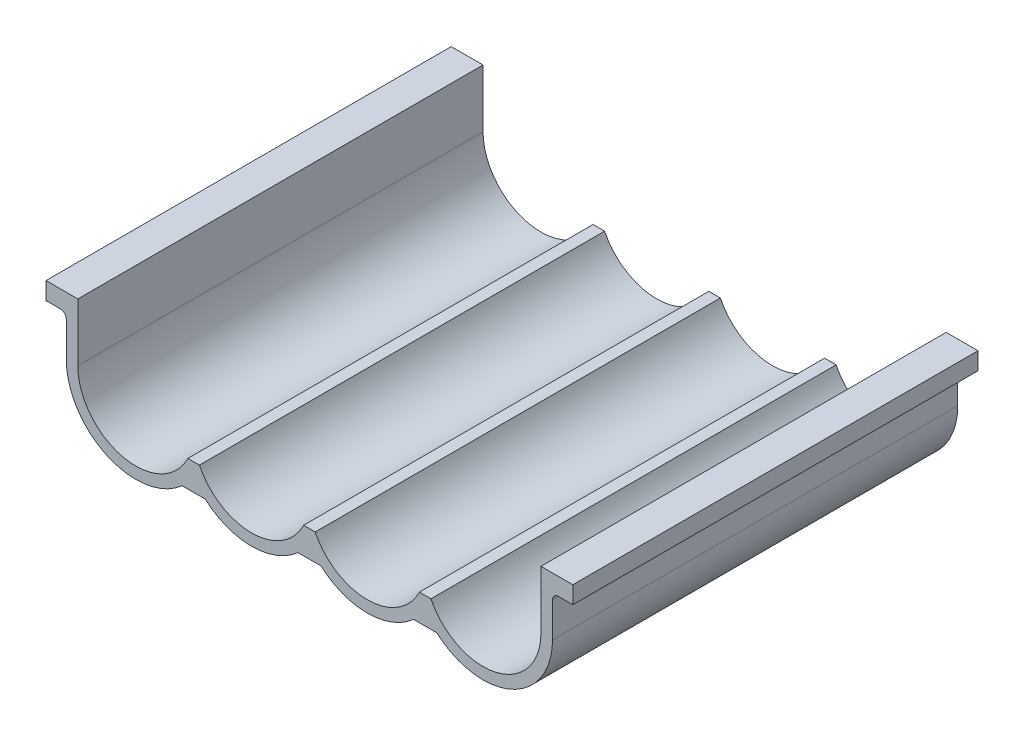
ISO-10303-21;
HEADER;
FILE_DESCRIPTION(('STEP AP214'),'2;1');
FILE_NAME('part.step','',(''),(''),'','','');
FILE_SCHEMA(('AUTOMOTIVE_DESIGN { 1 0 10303 214 1 1 1 1 }'));
ENDSEC;
DATA;
#1=APPLICATION_CONTEXT('core data for automotive mechanical design processes');
#2=APPLICATION_PROTOCOL_DEFINITION('international standard','automotive_design',2000,#1);
#3=PRODUCT_CONTEXT('',#1,'mechanical');
#4=PRODUCT('Part','Part','',(#3));
#5=PRODUCT_RELATED_PRODUCT_CATEGORY('part','',(#4));
#6=PRODUCT_DEFINITION_FORMATION('','',#4);
#7=PRODUCT_DEFINITION_CONTEXT('part definition',#1,'design');
#8=PRODUCT_DEFINITION('design','',#6,#7);
#9=PRODUCT_DEFINITION_SHAPE('','',#8);
#10=(LENGTH_UNIT() NAMED_UNIT(*) SI_UNIT(.MILLI.,.METRE.));
#11=(NAMED_UNIT(*) PLANE_ANGLE_UNIT() SI_UNIT($,.RADIAN.));
#12=(NAMED_UNIT(*) SI_UNIT($,.STERADIAN.) SOLID_ANGLE_UNIT());
#13=UNCERTAINTY_MEASURE_WITH_UNIT(LENGTH_MEASURE(1.E-05),#10,'distance_accuracy_value','');
#14=(GEOMETRIC_REPRESENTATION_CONTEXT(3) GLOBAL_UNCERTAINTY_ASSIGNED_CONTEXT((#13)) GLOBAL_UNIT_ASSIGNED_CONTEXT((#10,
#11,#12)) REPRESENTATION_CONTEXT('',''));
#15=CARTESIAN_POINT('',(0.,0.,0.));
#16=DIRECTION('',(0.,0.,1.));
#17=DIRECTION('',(1.,0.,0.));
#18=AXIS2_PLACEMENT_3D('',#15,#16,#17);
#19=CARTESIAN_POINT('',(0.,0.,70.));
#20=DIRECTION('',(1.,0.,0.));
#21=DIRECTION('',(0.,1.,0.));
#22=AXIS2_PLACEMENT_3D('',#19,#20,#21);
#23=PLANE('',#22);
#24=DIRECTION('',(0.,-1.,0.));
#25=VECTOR('',#24,1.);
#26=CARTESIAN_POINT('',(0.,0.,0.));
#27=LINE('',#26,#25);
#28=CARTESIAN_POINT('',(0.,0.,0.));
#29=VERTEX_POINT('',#28);
#30=CARTESIAN_POINT('',(0.,-3.,0.));
#31=VERTEX_POINT('',#30);
#32=EDGE_CURVE('E227',#29,#31,#27,.T.);
#33=ORIENTED_EDGE('',*,*,#32,.T.);
#34=DIRECTION('',(0.,0.,-1.));
#35=VECTOR('',#34,1.);
#36=CARTESIAN_POINT('',(0.,-3.,70.));
#37=LINE('',#36,#35);
#38=CARTESIAN_POINT('',(0.,-3.,70.));
#39=VERTEX_POINT('',#38);
#40=EDGE_CURVE('E210',#39,#31,#37,.T.);
#41=ORIENTED_EDGE('',*,*,#40,.F.);
#42=DIRECTION('',(0.,-1.,0.));
#43=VECTOR('',#42,1.);
#44=CARTESIAN_POINT('',(0.,0.,70.));
#45=LINE('',#44,#43);
#46=CARTESIAN_POINT('',(0.,0.,70.));
#47=VERTEX_POINT('',#46);
#48=EDGE_CURVE('E215',#47,#39,#45,.T.);
#49=ORIENTED_EDGE('',*,*,#48,.F.);
#50=DIRECTION('',(0.,0.,-1.));
#51=VECTOR('',#50,1.);
#52=CARTESIAN_POINT('',(0.,0.,70.));
#53=LINE('',#52,#51);
#54=EDGE_CURVE('E308',#47,#29,#53,.T.);
#55=ORIENTED_EDGE('',*,*,#54,.T.);
#56=EDGE_LOOP('',(#33,#41,#49,#55));
#57=FACE_BOUND('',#56,.T.);
#58=ADVANCED_FACE('F37',(#57),#23,.F.);
#59=CARTESIAN_POINT('',(0.,-3.,70.));
#60=DIRECTION('',(0.,1.,0.));
#61=DIRECTION('',(0.,0.,1.));
#62=AXIS2_PLACEMENT_3D('',#59,#60,#61);
#63=PLANE('',#62);
#64=DIRECTION('',(1.,0.,0.));
#65=VECTOR('',#64,1.);
#66=CARTESIAN_POINT('',(0.,-3.,0.));
#67=LINE('',#66,#65);
#68=CARTESIAN_POINT('',(2.49999999999999,-3.,0.));
#69=VERTEX_POINT('',#68);
#70=EDGE_CURVE('E425',#31,#69,#67,.T.);
#71=ORIENTED_EDGE('',*,*,#70,.T.);
#72=DIRECTION('',(0.,0.,-1.));
#73=VECTOR('',#72,1.);
#74=CARTESIAN_POINT('',(2.49999999999999,-3.,70.));
#75=LINE('',#74,#73);
#76=CARTESIAN_POINT('',(2.49999999999999,-3.,70.));
#77=VERTEX_POINT('',#76);
#78=EDGE_CURVE('E52',#69,#77,#75,.F.);
#79=ORIENTED_EDGE('',*,*,#78,.T.);
#80=DIRECTION('',(1.,0.,0.));
#81=VECTOR('',#80,1.);
#82=CARTESIAN_POINT('',(0.,-3.,70.));
#83=LINE('',#82,#81);
#84=EDGE_CURVE('E206',#39,#77,#83,.T.);
#85=ORIENTED_EDGE('',*,*,#84,.F.);
#86=ORIENTED_EDGE('',*,*,#40,.T.);
#87=EDGE_LOOP('',(#71,#79,#85,#86));
#88=FACE_BOUND('',#87,.T.);
#89=ADVANCED_FACE('F208',(#88),#63,.F.);
#90=CARTESIAN_POINT('',(3.49999999999999,-10.,70.));
#91=DIRECTION('',(1.,0.,0.));
#92=DIRECTION('',(0.,0.,-1.));
#93=AXIS2_PLACEMENT_3D('',#90,#91,#92);
#94=PLANE('',#93);
#95=DIRECTION('',(0.,-1.,0.));
#96=VECTOR('',#95,1.);
#97=CARTESIAN_POINT('',(3.49999999999999,-10.,70.));
#98=LINE('',#97,#96);
#99=CARTESIAN_POINT('',(3.49999999999999,-4.,70.));
#100=VERTEX_POINT('',#99);
#101=CARTESIAN_POINT('',(3.49999999999999,-10.,70.));
#102=VERTEX_POINT('',#101);
#103=EDGE_CURVE('E214',#100,#102,#98,.T.);
#104=ORIENTED_EDGE('',*,*,#103,.F.);
#105=DIRECTION('',(0.,0.,-1.));
#106=VECTOR('',#105,1.);
#107=CARTESIAN_POINT('',(3.49999999999999,-4.,0.));
#108=LINE('',#107,#106);
#109=CARTESIAN_POINT('',(3.49999999999999,-4.,0.));
#110=VERTEX_POINT('',#109);
#111=EDGE_CURVE('E240',#100,#110,#108,.T.);
#112=ORIENTED_EDGE('',*,*,#111,.T.);
#113=DIRECTION('',(0.,-1.,0.));
#114=VECTOR('',#113,1.);
#115=CARTESIAN_POINT('',(3.49999999999999,-10.,0.));
#116=LINE('',#115,#114);
#117=CARTESIAN_POINT('',(3.49999999999999,-10.,0.));
#118=VERTEX_POINT('',#117);
#119=EDGE_CURVE('E378',#110,#118,#116,.T.);
#120=ORIENTED_EDGE('',*,*,#119,.T.);
#121=DIRECTION('',(0.,0.,-1.));
#122=VECTOR('',#121,1.);
#123=CARTESIAN_POINT('',(3.49999999999999,-10.,70.));
#124=LINE('',#123,#122);
#125=EDGE_CURVE('E229',#102,#118,#124,.T.);
#126=ORIENTED_EDGE('',*,*,#125,.F.);
#127=EDGE_LOOP('',(#104,#112,#120,#126));
#128=FACE_BOUND('',#127,.T.);
#129=ADVANCED_FACE('F429',(#128),#94,.F.);
#130=CARTESIAN_POINT('',(15.5,-10.,70.));
#131=DIRECTION('',(0.,0.,-1.));
#132=DIRECTION('',(-1.,0.,0.));
#133=AXIS2_PLACEMENT_3D('',#130,#131,#132);
#134=CYLINDRICAL_SURFACE('',#133,12.);
#135=CARTESIAN_POINT('',(15.5,-10.,0.));
#136=DIRECTION('',(0.,0.,1.));
#137=DIRECTION('',(1.,0.,0.));
#138=AXIS2_PLACEMENT_3D('',#135,#136,#137);
#139=CIRCLE('',#138,12.);
#140=CARTESIAN_POINT('',(23.5,-18.9442719099992,0.));
#141=VERTEX_POINT('',#140);
#142=EDGE_CURVE('E372',#118,#141,#139,.T.);
#143=ORIENTED_EDGE('',*,*,#142,.T.);
#144=DIRECTION('',(0.,0.,-1.));
#145=VECTOR('',#144,1.);
#146=CARTESIAN_POINT('',(23.5,-18.9442719099992,70.));
#147=LINE('',#146,#145);
#148=CARTESIAN_POINT('',(23.5,-18.9442719099992,70.));
#149=VERTEX_POINT('',#148);
#150=EDGE_CURVE('E235',#149,#141,#147,.T.);
#151=ORIENTED_EDGE('',*,*,#150,.F.);
#152=CARTESIAN_POINT('',(15.5,-10.,70.));
#153=DIRECTION('',(0.,0.,1.));
#154=DIRECTION('',(1.,0.,0.));
#155=AXIS2_PLACEMENT_3D('',#152,#153,#154);
#156=CIRCLE('',#155,12.);
#157=EDGE_CURVE('E432',#102,#149,#156,.T.);
#158=ORIENTED_EDGE('',*,*,#157,.F.);
#159=ORIENTED_EDGE('',*,*,#125,.T.);
#160=EDGE_LOOP('',(#143,#151,#158,#159));
#161=FACE_BOUND('',#160,.T.);
#162=ADVANCED_FACE('F431',(#161),#134,.T.);
#163=CARTESIAN_POINT('',(23.5,-18.9442719099992,70.));
#164=DIRECTION('',(0.,1.,0.));
#165=DIRECTION('',(0.,0.,1.));
#166=AXIS2_PLACEMENT_3D('',#163,#164,#165);
#167=PLANE('',#166);
#168=DIRECTION('',(1.,0.,0.));
#169=VECTOR('',#168,1.);
#170=CARTESIAN_POINT('',(23.5,-18.9442719099992,0.));
#171=LINE('',#170,#169);
#172=CARTESIAN_POINT('',(27.5,-18.9442719099992,0.));
#173=VERTEX_POINT('',#172);
#174=EDGE_CURVE('E366',#141,#173,#171,.T.);
#175=ORIENTED_EDGE('',*,*,#174,.T.);
#176=DIRECTION('',(0.,0.,-1.));
#177=VECTOR('',#176,1.);
#178=CARTESIAN_POINT('',(27.5,-18.9442719099992,70.));
#179=LINE('',#178,#177);
#180=CARTESIAN_POINT('',(27.5,-18.9442719099992,70.));
#181=VERTEX_POINT('',#180);
#182=EDGE_CURVE('E357',#181,#173,#179,.T.);
#183=ORIENTED_EDGE('',*,*,#182,.F.);
#184=DIRECTION('',(1.,0.,0.));
#185=VECTOR('',#184,1.);
#186=CARTESIAN_POINT('',(23.5,-18.9442719099992,70.));
#187=LINE('',#186,#185);
#188=EDGE_CURVE('E367',#149,#181,#187,.T.);
#189=ORIENTED_EDGE('',*,*,#188,.F.);
#190=ORIENTED_EDGE('',*,*,#150,.T.);
#191=EDGE_LOOP('',(#175,#183,#189,#190));
#192=FACE_BOUND('',#191,.T.);
#193=ADVANCED_FACE('F364',(#192),#167,.F.);
#194=CARTESIAN_POINT('',(35.5,-10.,70.));
#195=DIRECTION('',(0.,0.,-1.));
#196=DIRECTION('',(-1.,0.,0.));
#197=AXIS2_PLACEMENT_3D('',#194,#195,#196);
#198=CYLINDRICAL_SURFACE('',#197,12.);
#199=CARTESIAN_POINT('',(35.5,-10.,0.));
#200=DIRECTION('',(0.,0.,1.));
#201=DIRECTION('',(1.,0.,0.));
#202=AXIS2_PLACEMENT_3D('',#199,#200,#201);
#203=CIRCLE('',#202,12.);
#204=CARTESIAN_POINT('',(43.5,-18.9442719099992,0.));
#205=VERTEX_POINT('',#204);
#206=EDGE_CURVE('E374',#173,#205,#203,.T.);
#207=ORIENTED_EDGE('',*,*,#206,.T.);
#208=DIRECTION('',(0.,0.,-1.));
#209=VECTOR('',#208,1.);
#210=CARTESIAN_POINT('',(43.5,-18.9442719099992,70.));
#211=LINE('',#210,#209);
#212=CARTESIAN_POINT('',(43.5,-18.9442719099992,70.));
#213=VERTEX_POINT('',#212);
#214=EDGE_CURVE('E354',#213,#205,#211,.T.);
#215=ORIENTED_EDGE('',*,*,#214,.F.);
#216=CARTESIAN_POINT('',(35.5,-10.,70.));
#217=DIRECTION('',(0.,0.,1.));
#218=DIRECTION('',(1.,0.,0.));
#219=AXIS2_PLACEMENT_3D('',#216,#217,#218);
#220=CIRCLE('',#219,12.);
#221=EDGE_CURVE('E434',#181,#213,#220,.T.);
#222=ORIENTED_EDGE('',*,*,#221,.F.);
#223=ORIENTED_EDGE('',*,*,#182,.T.);
#224=EDGE_LOOP('',(#207,#215,#222,#223));
#225=FACE_BOUND('',#224,.T.);
#226=ADVANCED_FACE('F450',(#225),#198,.T.);
#227=CARTESIAN_POINT('',(43.5,-18.9442719099992,70.));
#228=DIRECTION('',(0.,1.,0.));
#229=DIRECTION('',(0.,0.,1.));
#230=AXIS2_PLACEMENT_3D('',#227,#228,#229);
#231=PLANE('',#230);
#232=DIRECTION('',(1.,0.,0.));
#233=VECTOR('',#232,1.);
#234=CARTESIAN_POINT('',(43.5,-18.9442719099992,0.));
#235=LINE('',#234,#233);
#236=CARTESIAN_POINT('',(47.5,-18.9442719099992,0.));
#237=VERTEX_POINT('',#236);
#238=EDGE_CURVE('E376',#205,#237,#235,.T.);
#239=ORIENTED_EDGE('',*,*,#238,.T.);
#240=DIRECTION('',(0.,0.,-1.));
#241=VECTOR('',#240,1.);
#242=CARTESIAN_POINT('',(47.5,-18.9442719099992,70.));
#243=LINE('',#242,#241);
#244=CARTESIAN_POINT('',(47.5,-18.9442719099992,70.));
#245=VERTEX_POINT('',#244);
#246=EDGE_CURVE('E351',#245,#237,#243,.T.);
#247=ORIENTED_EDGE('',*,*,#246,.F.);
#248=DIRECTION('',(1.,0.,0.));
#249=VECTOR('',#248,1.);
#250=CARTESIAN_POINT('',(43.5,-18.9442719099992,70.));
#251=LINE('',#250,#249);
#252=EDGE_CURVE('E439',#213,#245,#251,.T.);
#253=ORIENTED_EDGE('',*,*,#252,.F.);
#254=ORIENTED_EDGE('',*,*,#214,.T.);
#255=EDGE_LOOP('',(#239,#247,#253,#254));
#256=FACE_BOUND('',#255,.T.);
#257=ADVANCED_FACE('F446',(#256),#231,.F.);
#258=CARTESIAN_POINT('',(55.5,-10.,70.));
#259=DIRECTION('',(0.,0.,-1.));
#260=DIRECTION('',(-1.,0.,0.));
#261=AXIS2_PLACEMENT_3D('',#258,#259,#260);
#262=CYLINDRICAL_SURFACE('',#261,12.);
#263=CARTESIAN_POINT('',(55.5,-10.,0.));
#264=DIRECTION('',(0.,0.,1.));
#265=DIRECTION('',(-1.,0.,0.));
#266=AXIS2_PLACEMENT_3D('',#263,#264,#265);
#267=CIRCLE('',#266,12.);
#268=CARTESIAN_POINT('',(63.5,-18.9442719099992,0.));
#269=VERTEX_POINT('',#268);
#270=EDGE_CURVE('E383',#237,#269,#267,.T.);
#271=ORIENTED_EDGE('',*,*,#270,.T.);
#272=DIRECTION('',(0.,0.,-1.));
#273=VECTOR('',#272,1.);
#274=CARTESIAN_POINT('',(63.5,-18.9442719099992,70.));
#275=LINE('',#274,#273);
#276=CARTESIAN_POINT('',(63.5,-18.9442719099992,70.));
#277=VERTEX_POINT('',#276);
#278=EDGE_CURVE('E348',#277,#269,#275,.T.);
#279=ORIENTED_EDGE('',*,*,#278,.F.);
#280=CARTESIAN_POINT('',(55.5,-10.,70.));
#281=DIRECTION('',(0.,0.,1.));
#282=DIRECTION('',(-1.,0.,0.));
#283=AXIS2_PLACEMENT_3D('',#280,#281,#282);
#284=CIRCLE('',#283,12.);
#285=EDGE_CURVE('E398',#245,#277,#284,.T.);
#286=ORIENTED_EDGE('',*,*,#285,.F.);
#287=ORIENTED_EDGE('',*,*,#246,.T.);
#288=EDGE_LOOP('',(#271,#279,#286,#287));
#289=FACE_BOUND('',#288,.T.);
#290=ADVANCED_FACE('F444',(#289),#262,.T.);
#291=CARTESIAN_POINT('',(67.5,-18.9442719099992,70.));
#292=DIRECTION('',(0.,1.,0.));
#293=DIRECTION('',(-1.,0.,0.));
#294=AXIS2_PLACEMENT_3D('',#291,#292,#293);
#295=PLANE('',#294);
#296=DIRECTION('',(1.,0.,0.));
#297=VECTOR('',#296,1.);
#298=CARTESIAN_POINT('',(67.5,-18.9442719099992,0.));
#299=LINE('',#298,#297);
#300=CARTESIAN_POINT('',(67.5,-18.9442719099991,0.));
#301=VERTEX_POINT('',#300);
#302=EDGE_CURVE('E282',#269,#301,#299,.T.);
#303=ORIENTED_EDGE('',*,*,#302,.T.);
#304=DIRECTION('',(0.,0.,-1.));
#305=VECTOR('',#304,1.);
#306=CARTESIAN_POINT('',(67.5,-18.9442719099991,70.));
#307=LINE('',#306,#305);
#308=CARTESIAN_POINT('',(67.5,-18.9442719099991,70.));
#309=VERTEX_POINT('',#308);
#310=EDGE_CURVE('E345',#309,#301,#307,.T.);
#311=ORIENTED_EDGE('',*,*,#310,.F.);
#312=DIRECTION('',(1.,0.,0.));
#313=VECTOR('',#312,1.);
#314=CARTESIAN_POINT('',(67.5,-18.9442719099992,70.));
#315=LINE('',#314,#313);
#316=EDGE_CURVE('E395',#277,#309,#315,.T.);
#317=ORIENTED_EDGE('',*,*,#316,.F.);
#318=ORIENTED_EDGE('',*,*,#278,.T.);
#319=EDGE_LOOP('',(#303,#311,#317,#318));
#320=FACE_BOUND('',#319,.T.);
#321=ADVANCED_FACE('F387',(#320),#295,.F.);
#322=CARTESIAN_POINT('',(75.5,-9.99999999999999,70.));
#323=DIRECTION('',(0.,0.,-1.));
#324=DIRECTION('',(-1.,0.,0.));
#325=AXIS2_PLACEMENT_3D('',#322,#323,#324);
#326=CYLINDRICAL_SURFACE('',#325,12.);
#327=CARTESIAN_POINT('',(75.5,-9.99999999999999,0.));
#328=DIRECTION('',(0.,0.,1.));
#329=DIRECTION('',(-1.,0.,0.));
#330=AXIS2_PLACEMENT_3D('',#327,#328,#329);
#331=CIRCLE('',#330,12.);
#332=CARTESIAN_POINT('',(87.5,-10.,0.));
#333=VERTEX_POINT('',#332);
#334=EDGE_CURVE('E278',#301,#333,#331,.T.);
#335=ORIENTED_EDGE('',*,*,#334,.T.);
#336=DIRECTION('',(0.,0.,-1.));
#337=VECTOR('',#336,1.);
#338=CARTESIAN_POINT('',(87.5,-10.,70.));
#339=LINE('',#338,#337);
#340=CARTESIAN_POINT('',(87.5,-10.,70.));
#341=VERTEX_POINT('',#340);
#342=EDGE_CURVE('E277',#341,#333,#339,.T.);
#343=ORIENTED_EDGE('',*,*,#342,.F.);
#344=CARTESIAN_POINT('',(75.5,-9.99999999999999,70.));
#345=DIRECTION('',(0.,0.,1.));
#346=DIRECTION('',(-1.,0.,0.));
#347=AXIS2_PLACEMENT_3D('',#344,#345,#346);
#348=CIRCLE('',#347,12.);
#349=EDGE_CURVE('E394',#309,#341,#348,.T.);
#350=ORIENTED_EDGE('',*,*,#349,.F.);
#351=ORIENTED_EDGE('',*,*,#310,.T.);
#352=EDGE_LOOP('',(#335,#343,#350,#351));
#353=FACE_BOUND('',#352,.T.);
#354=ADVANCED_FACE('F393',(#353),#326,.T.);
#355=CARTESIAN_POINT('',(87.5,-10.,70.));
#356=DIRECTION('',(-1.,0.,0.));
#357=DIRECTION('',(0.,0.,1.));
#358=AXIS2_PLACEMENT_3D('',#355,#356,#357);
#359=PLANE('',#358);
#360=DIRECTION('',(0.,1.,0.));
#361=VECTOR('',#360,1.);
#362=CARTESIAN_POINT('',(87.5,-10.,0.));
#363=LINE('',#362,#361);
#364=CARTESIAN_POINT('',(87.5,-4.,0.));
#365=VERTEX_POINT('',#364);
#366=EDGE_CURVE('E270',#333,#365,#363,.T.);
#367=ORIENTED_EDGE('',*,*,#366,.T.);
#368=DIRECTION('',(0.,0.,-1.));
#369=VECTOR('',#368,1.);
#370=CARTESIAN_POINT('',(87.5,-4.,70.));
#371=LINE('',#370,#369);
#372=CARTESIAN_POINT('',(87.5,-4.,70.));
#373=VERTEX_POINT('',#372);
#374=EDGE_CURVE('E232',#365,#373,#371,.F.);
#375=ORIENTED_EDGE('',*,*,#374,.T.);
#376=DIRECTION('',(0.,1.,0.));
#377=VECTOR('',#376,1.);
#378=CARTESIAN_POINT('',(87.5,-10.,70.));
#379=LINE('',#378,#377);
#380=EDGE_CURVE('E253',#341,#373,#379,.T.);
#381=ORIENTED_EDGE('',*,*,#380,.F.);
#382=ORIENTED_EDGE('',*,*,#342,.T.);
#383=EDGE_LOOP('',(#367,#375,#381,#382));
#384=FACE_BOUND('',#383,.T.);
#385=ADVANCED_FACE('F275',(#384),#359,.F.);
#386=CARTESIAN_POINT('',(91.,-2.99999999999999,70.));
#387=DIRECTION('',(0.,1.,0.));
#388=DIRECTION('',(-1.,0.,0.));
#389=AXIS2_PLACEMENT_3D('',#386,#387,#388);
#390=PLANE('',#389);
#391=DIRECTION('',(1.,0.,0.));
#392=VECTOR('',#391,1.);
#393=CARTESIAN_POINT('',(91.,-2.99999999999999,70.));
#394=LINE('',#393,#392);
#395=CARTESIAN_POINT('',(88.5,-3.,70.));
#396=VERTEX_POINT('',#395);
#397=CARTESIAN_POINT('',(91.,-2.99999999999999,70.));
#398=VERTEX_POINT('',#397);
#399=EDGE_CURVE('E250',#396,#398,#394,.T.);
#400=ORIENTED_EDGE('',*,*,#399,.F.);
#401=DIRECTION('',(0.,0.,-1.));
#402=VECTOR('',#401,1.);
#403=CARTESIAN_POINT('',(88.5,-3.,0.));
#404=LINE('',#403,#402);
#405=CARTESIAN_POINT('',(88.5,-3.,0.));
#406=VERTEX_POINT('',#405);
#407=EDGE_CURVE('E228',#396,#406,#404,.T.);
#408=ORIENTED_EDGE('',*,*,#407,.T.);
#409=DIRECTION('',(1.,0.,0.));
#410=VECTOR('',#409,1.);
#411=CARTESIAN_POINT('',(91.,-2.99999999999999,0.));
#412=LINE('',#411,#410);
#413=CARTESIAN_POINT('',(91.,-2.99999999999999,0.));
#414=VERTEX_POINT('',#413);
#415=EDGE_CURVE('E272',#406,#414,#412,.T.);
#416=ORIENTED_EDGE('',*,*,#415,.T.);
#417=DIRECTION('',(0.,0.,-1.));
#418=VECTOR('',#417,1.);
#419=CARTESIAN_POINT('',(91.,-2.99999999999999,70.));
#420=LINE('',#419,#418);
#421=EDGE_CURVE('E261',#398,#414,#420,.T.);
#422=ORIENTED_EDGE('',*,*,#421,.F.);
#423=EDGE_LOOP('',(#400,#408,#416,#422));
#424=FACE_BOUND('',#423,.T.);
#425=ADVANCED_FACE('F258',(#424),#390,.F.);
#426=CARTESIAN_POINT('',(91.,0.,70.));
#427=DIRECTION('',(-1.,0.,0.));
#428=DIRECTION('',(0.,-1.,0.));
#429=AXIS2_PLACEMENT_3D('',#426,#427,#428);
#430=PLANE('',#429);
#431=DIRECTION('',(0.,1.,0.));
#432=VECTOR('',#431,1.);
#433=CARTESIAN_POINT('',(91.,0.,0.));
#434=LINE('',#433,#432);
#435=CARTESIAN_POINT('',(91.,0.,0.));
#436=VERTEX_POINT('',#435);
#437=EDGE_CURVE('E280',#414,#436,#434,.T.);
#438=ORIENTED_EDGE('',*,*,#437,.T.);
#439=DIRECTION('',(0.,0.,-1.));
#440=VECTOR('',#439,1.);
#441=CARTESIAN_POINT('',(91.,0.,70.));
#442=LINE('',#441,#440);
#443=CARTESIAN_POINT('',(91.,0.,70.));
#444=VERTEX_POINT('',#443);
#445=EDGE_CURVE('E340',#444,#436,#442,.T.);
#446=ORIENTED_EDGE('',*,*,#445,.F.);
#447=DIRECTION('',(0.,1.,0.));
#448=VECTOR('',#447,1.);
#449=CARTESIAN_POINT('',(91.,0.,70.));
#450=LINE('',#449,#448);
#451=EDGE_CURVE('E263',#398,#444,#450,.T.);
#452=ORIENTED_EDGE('',*,*,#451,.F.);
#453=ORIENTED_EDGE('',*,*,#421,.T.);
#454=EDGE_LOOP('',(#438,#446,#452,#453));
#455=FACE_BOUND('',#454,.T.);
#456=ADVANCED_FACE('F521',(#455),#430,.F.);
#457=CARTESIAN_POINT('',(91.,0.,70.));
#458=DIRECTION('',(0.,-1.,0.));
#459=DIRECTION('',(1.,0.,0.));
#460=AXIS2_PLACEMENT_3D('',#457,#458,#459);
#461=PLANE('',#460);
#462=DIRECTION('',(-1.,0.,0.));
#463=VECTOR('',#462,1.);
#464=CARTESIAN_POINT('',(91.,0.,0.));
#465=LINE('',#464,#463);
#466=CARTESIAN_POINT('',(85.5,0.,0.));
#467=VERTEX_POINT('',#466);
#468=EDGE_CURVE('E287',#436,#467,#465,.T.);
#469=ORIENTED_EDGE('',*,*,#468,.T.);
#470=DIRECTION('',(0.,0.,-1.));
#471=VECTOR('',#470,1.);
#472=CARTESIAN_POINT('',(85.5,0.,70.));
#473=LINE('',#472,#471);
#474=CARTESIAN_POINT('',(85.5,0.,70.));
#475=VERTEX_POINT('',#474);
#476=EDGE_CURVE('E337',#475,#467,#473,.T.);
#477=ORIENTED_EDGE('',*,*,#476,.F.);
#478=DIRECTION('',(-1.,0.,0.));
#479=VECTOR('',#478,1.);
#480=CARTESIAN_POINT('',(91.,0.,70.));
#481=LINE('',#480,#479);
#482=EDGE_CURVE('E403',#444,#475,#481,.T.);
#483=ORIENTED_EDGE('',*,*,#482,.F.);
#484=ORIENTED_EDGE('',*,*,#445,.T.);
#485=EDGE_LOOP('',(#469,#477,#483,#484));
#486=FACE_BOUND('',#485,.T.);
#487=ADVANCED_FACE('F517',(#486),#461,.F.);
#488=CARTESIAN_POINT('',(85.5,-9.99999999999999,70.));
#489=DIRECTION('',(1.,0.,0.));
#490=DIRECTION('',(0.,1.,0.));
#491=AXIS2_PLACEMENT_3D('',#488,#489,#490);
#492=PLANE('',#491);
#493=DIRECTION('',(0.,-1.,0.));
#494=VECTOR('',#493,1.);
#495=CARTESIAN_POINT('',(85.5,-9.99999999999999,0.));
#496=LINE('',#495,#494);
#497=CARTESIAN_POINT('',(85.5,-9.99999999999999,0.));
#498=VERTEX_POINT('',#497);
#499=EDGE_CURVE('E289',#467,#498,#496,.T.);
#500=ORIENTED_EDGE('',*,*,#499,.T.);
#501=DIRECTION('',(0.,0.,-1.));
#502=VECTOR('',#501,1.);
#503=CARTESIAN_POINT('',(85.5,-9.99999999999999,70.));
#504=LINE('',#503,#502);
#505=CARTESIAN_POINT('',(85.5,-9.99999999999999,70.));
#506=VERTEX_POINT('',#505);
#507=EDGE_CURVE('E334',#506,#498,#504,.T.);
#508=ORIENTED_EDGE('',*,*,#507,.F.);
#509=DIRECTION('',(0.,-1.,0.));
#510=VECTOR('',#509,1.);
#511=CARTESIAN_POINT('',(85.5,-9.99999999999999,70.));
#512=LINE('',#511,#510);
#513=EDGE_CURVE('E405',#475,#506,#512,.T.);
#514=ORIENTED_EDGE('',*,*,#513,.F.);
#515=ORIENTED_EDGE('',*,*,#476,.T.);
#516=EDGE_LOOP('',(#500,#508,#514,#515));
#517=FACE_BOUND('',#516,.T.);
#518=ADVANCED_FACE('F513',(#517),#492,.F.);
#519=CARTESIAN_POINT('',(75.5,-9.99999999999999,70.));
#520=DIRECTION('',(0.,0.,-1.));
#521=DIRECTION('',(-1.,0.,0.));
#522=AXIS2_PLACEMENT_3D('',#519,#520,#521);
#523=CYLINDRICAL_SURFACE('',#522,9.99999999999998);
#524=CARTESIAN_POINT('',(75.5,-9.99999999999999,0.));
#525=DIRECTION('',(0.,0.,-1.));
#526=DIRECTION('',(1.,0.,0.));
#527=AXIS2_PLACEMENT_3D('',#524,#525,#526);
#528=CIRCLE('',#527,9.99999999999998);
#529=CARTESIAN_POINT('',(66.5,-14.3588989435406,0.));
#530=VERTEX_POINT('',#529);
#531=EDGE_CURVE('E291',#498,#530,#528,.T.);
#532=ORIENTED_EDGE('',*,*,#531,.T.);
#533=DIRECTION('',(0.,0.,-1.));
#534=VECTOR('',#533,1.);
#535=CARTESIAN_POINT('',(66.5,-14.3588989435406,70.));
#536=LINE('',#535,#534);
#537=CARTESIAN_POINT('',(66.5,-14.3588989435406,70.));
#538=VERTEX_POINT('',#537);
#539=EDGE_CURVE('E331',#538,#530,#536,.T.);
#540=ORIENTED_EDGE('',*,*,#539,.F.);
#541=CARTESIAN_POINT('',(75.5,-9.99999999999999,70.));
#542=DIRECTION('',(0.,0.,-1.));
#543=DIRECTION('',(1.,0.,0.));
#544=AXIS2_PLACEMENT_3D('',#541,#542,#543);
#545=CIRCLE('',#544,9.99999999999998);
#546=EDGE_CURVE('E407',#506,#538,#545,.T.);
#547=ORIENTED_EDGE('',*,*,#546,.F.);
#548=ORIENTED_EDGE('',*,*,#507,.T.);
#549=EDGE_LOOP('',(#532,#540,#547,#548));
#550=FACE_BOUND('',#549,.T.);
#551=ADVANCED_FACE('F509',(#550),#523,.F.);
#552=CARTESIAN_POINT('',(66.5,-14.3588989435406,70.));
#553=DIRECTION('',(0.,-1.,0.));
#554=DIRECTION('',(0.,0.,-1.));
#555=AXIS2_PLACEMENT_3D('',#552,#553,#554);
#556=PLANE('',#555);
#557=DIRECTION('',(-1.,0.,0.));
#558=VECTOR('',#557,1.);
#559=CARTESIAN_POINT('',(66.5,-14.3588989435406,0.));
#560=LINE('',#559,#558);
#561=CARTESIAN_POINT('',(64.5,-14.3588989435406,0.));
#562=VERTEX_POINT('',#561);
#563=EDGE_CURVE('E293',#530,#562,#560,.T.);
#564=ORIENTED_EDGE('',*,*,#563,.T.);
#565=DIRECTION('',(0.,0.,-1.));
#566=VECTOR('',#565,1.);
#567=CARTESIAN_POINT('',(64.5,-14.3588989435406,70.));
#568=LINE('',#567,#566);
#569=CARTESIAN_POINT('',(64.5,-14.3588989435406,70.));
#570=VERTEX_POINT('',#569);
#571=EDGE_CURVE('E328',#570,#562,#568,.T.);
#572=ORIENTED_EDGE('',*,*,#571,.F.);
#573=DIRECTION('',(-1.,0.,0.));
#574=VECTOR('',#573,1.);
#575=CARTESIAN_POINT('',(66.5,-14.3588989435406,70.));
#576=LINE('',#575,#574);
#577=EDGE_CURVE('E409',#538,#570,#576,.T.);
#578=ORIENTED_EDGE('',*,*,#577,.F.);
#579=ORIENTED_EDGE('',*,*,#539,.T.);
#580=EDGE_LOOP('',(#564,#572,#578,#579));
#581=FACE_BOUND('',#580,.T.);
#582=ADVANCED_FACE('F505',(#581),#556,.F.);
#583=CARTESIAN_POINT('',(55.5,-10.,70.));
#584=DIRECTION('',(0.,0.,-1.));
#585=DIRECTION('',(-1.,0.,0.));
#586=AXIS2_PLACEMENT_3D('',#583,#584,#585);
#587=CYLINDRICAL_SURFACE('',#586,9.99999999999998);
#588=CARTESIAN_POINT('',(55.5,-10.,0.));
#589=DIRECTION('',(0.,0.,-1.));
#590=DIRECTION('',(-1.,0.,0.));
#591=AXIS2_PLACEMENT_3D('',#588,#589,#590);
#592=CIRCLE('',#591,9.99999999999998);
#593=CARTESIAN_POINT('',(46.5,-14.3588989435407,0.));
#594=VERTEX_POINT('',#593);
#595=EDGE_CURVE('E295',#562,#594,#592,.T.);
#596=ORIENTED_EDGE('',*,*,#595,.T.);
#597=DIRECTION('',(0.,0.,-1.));
#598=VECTOR('',#597,1.);
#599=CARTESIAN_POINT('',(46.5,-14.3588989435407,70.));
#600=LINE('',#599,#598);
#601=CARTESIAN_POINT('',(46.5,-14.3588989435407,70.));
#602=VERTEX_POINT('',#601);
#603=EDGE_CURVE('E325',#602,#594,#600,.T.);
#604=ORIENTED_EDGE('',*,*,#603,.F.);
#605=CARTESIAN_POINT('',(55.5,-10.,70.));
#606=DIRECTION('',(0.,0.,-1.));
#607=DIRECTION('',(-1.,0.,0.));
#608=AXIS2_PLACEMENT_3D('',#605,#606,#607);
#609=CIRCLE('',#608,9.99999999999998);
#610=EDGE_CURVE('E411',#570,#602,#609,.T.);
#611=ORIENTED_EDGE('',*,*,#610,.F.);
#612=ORIENTED_EDGE('',*,*,#571,.T.);
#613=EDGE_LOOP('',(#596,#604,#611,#612));
#614=FACE_BOUND('',#613,.T.);
#615=ADVANCED_FACE('F501',(#614),#587,.F.);
#616=CARTESIAN_POINT('',(44.5,-14.3588989435407,70.));
#617=DIRECTION('',(0.,-1.,0.));
#618=DIRECTION('',(0.,0.,-1.));
#619=AXIS2_PLACEMENT_3D('',#616,#617,#618);
#620=PLANE('',#619);
#621=DIRECTION('',(-1.,0.,0.));
#622=VECTOR('',#621,1.);
#623=CARTESIAN_POINT('',(44.5,-14.3588989435407,0.));
#624=LINE('',#623,#622);
#625=CARTESIAN_POINT('',(44.5,-14.3588989435407,0.));
#626=VERTEX_POINT('',#625);
#627=EDGE_CURVE('E297',#594,#626,#624,.T.);
#628=ORIENTED_EDGE('',*,*,#627,.T.);
#629=DIRECTION('',(0.,0.,-1.));
#630=VECTOR('',#629,1.);
#631=CARTESIAN_POINT('',(44.5,-14.3588989435407,70.));
#632=LINE('',#631,#630);
#633=CARTESIAN_POINT('',(44.5,-14.3588989435407,70.));
#634=VERTEX_POINT('',#633);
#635=EDGE_CURVE('E322',#634,#626,#632,.T.);
#636=ORIENTED_EDGE('',*,*,#635,.F.);
#637=DIRECTION('',(-1.,0.,0.));
#638=VECTOR('',#637,1.);
#639=CARTESIAN_POINT('',(44.5,-14.3588989435407,70.));
#640=LINE('',#639,#638);
#641=EDGE_CURVE('E413',#602,#634,#640,.T.);
#642=ORIENTED_EDGE('',*,*,#641,.F.);
#643=ORIENTED_EDGE('',*,*,#603,.T.);
#644=EDGE_LOOP('',(#628,#636,#642,#643));
#645=FACE_BOUND('',#644,.T.);
#646=ADVANCED_FACE('F497',(#645),#620,.F.);
#647=CARTESIAN_POINT('',(35.5,-10.,70.));
#648=DIRECTION('',(0.,0.,-1.));
#649=DIRECTION('',(-1.,0.,0.));
#650=AXIS2_PLACEMENT_3D('',#647,#648,#649);
#651=CYLINDRICAL_SURFACE('',#650,9.99999999999998);
#652=CARTESIAN_POINT('',(35.5,-10.,0.));
#653=DIRECTION('',(0.,0.,-1.));
#654=DIRECTION('',(1.,0.,0.));
#655=AXIS2_PLACEMENT_3D('',#652,#653,#654);
#656=CIRCLE('',#655,9.99999999999998);
#657=CARTESIAN_POINT('',(26.5,-14.3588989435406,0.));
#658=VERTEX_POINT('',#657);
#659=EDGE_CURVE('E299',#626,#658,#656,.T.);
#660=ORIENTED_EDGE('',*,*,#659,.T.);
#661=DIRECTION('',(0.,0.,-1.));
#662=VECTOR('',#661,1.);
#663=CARTESIAN_POINT('',(26.5,-14.3588989435406,70.));
#664=LINE('',#663,#662);
#665=CARTESIAN_POINT('',(26.5,-14.3588989435406,70.));
#666=VERTEX_POINT('',#665);
#667=EDGE_CURVE('E319',#666,#658,#664,.T.);
#668=ORIENTED_EDGE('',*,*,#667,.F.);
#669=CARTESIAN_POINT('',(35.5,-10.,70.));
#670=DIRECTION('',(0.,0.,-1.));
#671=DIRECTION('',(1.,0.,0.));
#672=AXIS2_PLACEMENT_3D('',#669,#670,#671);
#673=CIRCLE('',#672,9.99999999999998);
#674=EDGE_CURVE('E415',#634,#666,#673,.T.);
#675=ORIENTED_EDGE('',*,*,#674,.F.);
#676=ORIENTED_EDGE('',*,*,#635,.T.);
#677=EDGE_LOOP('',(#660,#668,#675,#676));
#678=FACE_BOUND('',#677,.T.);
#679=ADVANCED_FACE('F493',(#678),#651,.F.);
#680=CARTESIAN_POINT('',(24.5,-14.3588989435406,70.));
#681=DIRECTION('',(0.,-1.,0.));
#682=DIRECTION('',(0.,0.,-1.));
#683=AXIS2_PLACEMENT_3D('',#680,#681,#682);
#684=PLANE('',#683);
#685=DIRECTION('',(-1.,0.,0.));
#686=VECTOR('',#685,1.);
#687=CARTESIAN_POINT('',(24.5,-14.3588989435406,0.));
#688=LINE('',#687,#686);
#689=CARTESIAN_POINT('',(24.5,-14.3588989435406,0.));
#690=VERTEX_POINT('',#689);
#691=EDGE_CURVE('E301',#658,#690,#688,.T.);
#692=ORIENTED_EDGE('',*,*,#691,.T.);
#693=DIRECTION('',(0.,0.,-1.));
#694=VECTOR('',#693,1.);
#695=CARTESIAN_POINT('',(24.5,-14.3588989435406,70.));
#696=LINE('',#695,#694);
#697=CARTESIAN_POINT('',(24.5,-14.3588989435406,70.));
#698=VERTEX_POINT('',#697);
#699=EDGE_CURVE('E316',#698,#690,#696,.T.);
#700=ORIENTED_EDGE('',*,*,#699,.F.);
#701=DIRECTION('',(-1.,0.,0.));
#702=VECTOR('',#701,1.);
#703=CARTESIAN_POINT('',(24.5,-14.3588989435406,70.));
#704=LINE('',#703,#702);
#705=EDGE_CURVE('E417',#666,#698,#704,.T.);
#706=ORIENTED_EDGE('',*,*,#705,.F.);
#707=ORIENTED_EDGE('',*,*,#667,.T.);
#708=EDGE_LOOP('',(#692,#700,#706,#707));
#709=FACE_BOUND('',#708,.T.);
#710=ADVANCED_FACE('F489',(#709),#684,.F.);
#711=CARTESIAN_POINT('',(15.5,-10.,70.));
#712=DIRECTION('',(0.,0.,-1.));
#713=DIRECTION('',(-1.,0.,0.));
#714=AXIS2_PLACEMENT_3D('',#711,#712,#713);
#715=CYLINDRICAL_SURFACE('',#714,9.99999999999998);
#716=CARTESIAN_POINT('',(15.5,-10.,0.));
#717=DIRECTION('',(0.,0.,-1.));
#718=DIRECTION('',(-1.,0.,0.));
#719=AXIS2_PLACEMENT_3D('',#716,#717,#718);
#720=CIRCLE('',#719,9.99999999999998);
#721=CARTESIAN_POINT('',(5.5,-10.,0.));
#722=VERTEX_POINT('',#721);
#723=EDGE_CURVE('E303',#690,#722,#720,.T.);
#724=ORIENTED_EDGE('',*,*,#723,.T.);
#725=DIRECTION('',(0.,0.,-1.));
#726=VECTOR('',#725,1.);
#727=CARTESIAN_POINT('',(5.5,-10.,70.));
#728=LINE('',#727,#726);
#729=CARTESIAN_POINT('',(5.5,-10.,70.));
#730=VERTEX_POINT('',#729);
#731=EDGE_CURVE('E313',#730,#722,#728,.T.);
#732=ORIENTED_EDGE('',*,*,#731,.F.);
#733=CARTESIAN_POINT('',(15.5,-10.,70.));
#734=DIRECTION('',(0.,0.,-1.));
#735=DIRECTION('',(-1.,0.,0.));
#736=AXIS2_PLACEMENT_3D('',#733,#734,#735);
#737=CIRCLE('',#736,9.99999999999998);
#738=EDGE_CURVE('E419',#698,#730,#737,.T.);
#739=ORIENTED_EDGE('',*,*,#738,.F.);
#740=ORIENTED_EDGE('',*,*,#699,.T.);
#741=EDGE_LOOP('',(#724,#732,#739,#740));
#742=FACE_BOUND('',#741,.T.);
#743=ADVANCED_FACE('F485',(#742),#715,.F.);
#744=CARTESIAN_POINT('',(5.5,-10.,70.));
#745=DIRECTION('',(-1.,0.,0.));
#746=DIRECTION('',(0.,0.,1.));
#747=AXIS2_PLACEMENT_3D('',#744,#745,#746);
#748=PLANE('',#747);
#749=DIRECTION('',(0.,1.,0.));
#750=VECTOR('',#749,1.);
#751=CARTESIAN_POINT('',(5.5,-10.,0.));
#752=LINE('',#751,#750);
#753=CARTESIAN_POINT('',(5.5,0.,0.));
#754=VERTEX_POINT('',#753);
#755=EDGE_CURVE('E305',#722,#754,#752,.T.);
#756=ORIENTED_EDGE('',*,*,#755,.T.);
#757=DIRECTION('',(0.,0.,-1.));
#758=VECTOR('',#757,1.);
#759=CARTESIAN_POINT('',(5.5,0.,70.));
#760=LINE('',#759,#758);
#761=CARTESIAN_POINT('',(5.5,0.,70.));
#762=VERTEX_POINT('',#761);
#763=EDGE_CURVE('E310',#762,#754,#760,.T.);
#764=ORIENTED_EDGE('',*,*,#763,.F.);
#765=DIRECTION('',(0.,1.,0.));
#766=VECTOR('',#765,1.);
#767=CARTESIAN_POINT('',(5.5,-10.,70.));
#768=LINE('',#767,#766);
#769=EDGE_CURVE('E421',#730,#762,#768,.T.);
#770=ORIENTED_EDGE('',*,*,#769,.F.);
#771=ORIENTED_EDGE('',*,*,#731,.T.);
#772=EDGE_LOOP('',(#756,#764,#770,#771));
#773=FACE_BOUND('',#772,.T.);
#774=ADVANCED_FACE('F481',(#773),#748,.F.);
#775=CARTESIAN_POINT('',(0.,0.,70.));
#776=DIRECTION('',(0.,-1.,0.));
#777=DIRECTION('',(0.,0.,-1.));
#778=AXIS2_PLACEMENT_3D('',#775,#776,#777);
#779=PLANE('',#778);
#780=DIRECTION('',(-1.,0.,0.));
#781=VECTOR('',#780,1.);
#782=CARTESIAN_POINT('',(0.,0.,0.));
#783=LINE('',#782,#781);
#784=EDGE_CURVE('E224',#754,#29,#783,.T.);
#785=ORIENTED_EDGE('',*,*,#784,.T.);
#786=ORIENTED_EDGE('',*,*,#54,.F.);
#787=DIRECTION('',(-1.,0.,0.));
#788=VECTOR('',#787,1.);
#789=CARTESIAN_POINT('',(0.,0.,70.));
#790=LINE('',#789,#788);
#791=EDGE_CURVE('E220',#762,#47,#790,.T.);
#792=ORIENTED_EDGE('',*,*,#791,.F.);
#793=ORIENTED_EDGE('',*,*,#763,.T.);
#794=EDGE_LOOP('',(#785,#786,#792,#793));
#795=FACE_BOUND('',#794,.T.);
#796=ADVANCED_FACE('F476',(#795),#779,.F.);
#797=CARTESIAN_POINT('',(15.5,-10.,70.));
#798=DIRECTION('',(0.,0.,1.));
#799=DIRECTION('',(1.,0.,0.));
#800=AXIS2_PLACEMENT_3D('',#797,#798,#799);
#801=PLANE('',#800);
#802=ORIENTED_EDGE('',*,*,#48,.T.);
#803=ORIENTED_EDGE('',*,*,#84,.T.);
#804=CARTESIAN_POINT('',(2.49999999999999,-4.,70.));
#805=DIRECTION('',(0.,0.,1.));
#806=DIRECTION('',(1.,0.,0.));
#807=AXIS2_PLACEMENT_3D('',#804,#805,#806);
#808=CIRCLE('',#807,1.);
#809=EDGE_CURVE('E11',#77,#100,#808,.F.);
#810=ORIENTED_EDGE('',*,*,#809,.T.);
#811=ORIENTED_EDGE('',*,*,#103,.T.);
#812=ORIENTED_EDGE('',*,*,#157,.T.);
#813=ORIENTED_EDGE('',*,*,#188,.T.);
#814=ORIENTED_EDGE('',*,*,#221,.T.);
#815=ORIENTED_EDGE('',*,*,#252,.T.);
#816=ORIENTED_EDGE('',*,*,#285,.T.);
#817=ORIENTED_EDGE('',*,*,#316,.T.);
#818=ORIENTED_EDGE('',*,*,#349,.T.);
#819=ORIENTED_EDGE('',*,*,#380,.T.);
#820=CARTESIAN_POINT('',(88.5,-4.,70.));
#821=DIRECTION('',(0.,0.,1.));
#822=DIRECTION('',(1.,0.,0.));
#823=AXIS2_PLACEMENT_3D('',#820,#821,#822);
#824=CIRCLE('',#823,1.);
#825=EDGE_CURVE('E246',#373,#396,#824,.F.);
#826=ORIENTED_EDGE('',*,*,#825,.T.);
#827=ORIENTED_EDGE('',*,*,#399,.T.);
#828=ORIENTED_EDGE('',*,*,#451,.T.);
#829=ORIENTED_EDGE('',*,*,#482,.T.);
#830=ORIENTED_EDGE('',*,*,#513,.T.);
#831=ORIENTED_EDGE('',*,*,#546,.T.);
#832=ORIENTED_EDGE('',*,*,#577,.T.);
#833=ORIENTED_EDGE('',*,*,#610,.T.);
#834=ORIENTED_EDGE('',*,*,#641,.T.);
#835=ORIENTED_EDGE('',*,*,#674,.T.);
#836=ORIENTED_EDGE('',*,*,#705,.T.);
#837=ORIENTED_EDGE('',*,*,#738,.T.);
#838=ORIENTED_EDGE('',*,*,#769,.T.);
#839=ORIENTED_EDGE('',*,*,#791,.T.);
#840=EDGE_LOOP('',(#802,#803,#810,#811,#812,#813,#814,#815,#816,#817,#818,#819,#826,#827,#828,
#829,#830,#831,#832,#833,#834,#835,#836,#837,#838,#839));
#841=FACE_BOUND('',#840,.T.);
#842=ADVANCED_FACE('F218',(#841),#801,.T.);
#843=CARTESIAN_POINT('',(15.5,-10.,0.));
#844=DIRECTION('',(0.,0.,1.));
#845=DIRECTION('',(1.,0.,0.));
#846=AXIS2_PLACEMENT_3D('',#843,#844,#845);
#847=PLANE('',#846);
#848=ORIENTED_EDGE('',*,*,#32,.F.);
#849=ORIENTED_EDGE('',*,*,#784,.F.);
#850=ORIENTED_EDGE('',*,*,#755,.F.);
#851=ORIENTED_EDGE('',*,*,#723,.F.);
#852=ORIENTED_EDGE('',*,*,#691,.F.);
#853=ORIENTED_EDGE('',*,*,#659,.F.);
#854=ORIENTED_EDGE('',*,*,#627,.F.);
#855=ORIENTED_EDGE('',*,*,#595,.F.);
#856=ORIENTED_EDGE('',*,*,#563,.F.);
#857=ORIENTED_EDGE('',*,*,#531,.F.);
#858=ORIENTED_EDGE('',*,*,#499,.F.);
#859=ORIENTED_EDGE('',*,*,#468,.F.);
#860=ORIENTED_EDGE('',*,*,#437,.F.);
#861=ORIENTED_EDGE('',*,*,#415,.F.);
#862=CARTESIAN_POINT('',(88.5,-4.,0.));
#863=DIRECTION('',(0.,0.,1.));
#864=DIRECTION('',(1.,0.,0.));
#865=AXIS2_PLACEMENT_3D('',#862,#863,#864);
#866=CIRCLE('',#865,1.);
#867=EDGE_CURVE('E244',#406,#365,#866,.T.);
#868=ORIENTED_EDGE('',*,*,#867,.T.);
#869=ORIENTED_EDGE('',*,*,#366,.F.);
#870=ORIENTED_EDGE('',*,*,#334,.F.);
#871=ORIENTED_EDGE('',*,*,#302,.F.);
#872=ORIENTED_EDGE('',*,*,#270,.F.);
#873=ORIENTED_EDGE('',*,*,#238,.F.);
#874=ORIENTED_EDGE('',*,*,#206,.F.);
#875=ORIENTED_EDGE('',*,*,#174,.F.);
#876=ORIENTED_EDGE('',*,*,#142,.F.);
#877=ORIENTED_EDGE('',*,*,#119,.F.);
#878=CARTESIAN_POINT('',(2.49999999999999,-4.,0.));
#879=DIRECTION('',(0.,0.,1.));
#880=DIRECTION('',(1.,0.,0.));
#881=AXIS2_PLACEMENT_3D('',#878,#879,#880);
#882=CIRCLE('',#881,1.);
#883=EDGE_CURVE('E45',#110,#69,#882,.T.);
#884=ORIENTED_EDGE('',*,*,#883,.T.);
#885=ORIENTED_EDGE('',*,*,#70,.F.);
#886=EDGE_LOOP('',(#848,#849,#850,#851,#852,#853,#854,#855,#856,#857,#858,#859,#860,#861,#868,
#869,#870,#871,#872,#873,#874,#875,#876,#877,#884,#885));
#887=FACE_BOUND('',#886,.T.);
#888=ADVANCED_FACE('F268',(#887),#847,.F.);
#889=CARTESIAN_POINT('',(88.5,-4.,70.));
#890=DIRECTION('',(0.,0.,1.));
#891=DIRECTION('',(1.,0.,0.));
#892=AXIS2_PLACEMENT_3D('',#889,#890,#891);
#893=CYLINDRICAL_SURFACE('',#892,1.);
#894=ORIENTED_EDGE('',*,*,#825,.F.);
#895=ORIENTED_EDGE('',*,*,#374,.F.);
#896=ORIENTED_EDGE('',*,*,#867,.F.);
#897=ORIENTED_EDGE('',*,*,#407,.F.);
#898=EDGE_LOOP('',(#894,#895,#896,#897));
#899=FACE_BOUND('',#898,.T.);
#900=ADVANCED_FACE('F265',(#899),#893,.F.);
#901=CARTESIAN_POINT('',(2.49999999999999,-4.,70.));
#902=DIRECTION('',(0.,0.,1.));
#903=DIRECTION('',(1.,0.,0.));
#904=AXIS2_PLACEMENT_3D('',#901,#902,#903);
#905=CYLINDRICAL_SURFACE('',#904,1.);
#906=ORIENTED_EDGE('',*,*,#809,.F.);
#907=ORIENTED_EDGE('',*,*,#78,.F.);
#908=ORIENTED_EDGE('',*,*,#883,.F.);
#909=ORIENTED_EDGE('',*,*,#111,.F.);
#910=EDGE_LOOP('',(#906,#907,#908,#909));
#911=FACE_BOUND('',#910,.T.);
#912=ADVANCED_FACE('F39',(#911),#905,.F.);
#913=CLOSED_SHELL('',(#58,#89,#129,#162,#193,#226,#257,#290,#321,#354,#385,#425,#456,#487,#518,
#551,#582,#615,#646,#679,#710,#743,#774,#796,#842,#888,#900,#912));
#914=MANIFOLD_SOLID_BREP('B2',#913);
#915=ADVANCED_BREP_SHAPE_REPRESENTATION('',(#18,#914),#14);
#916=SHAPE_DEFINITION_REPRESENTATION(#9,#915);
ENDSEC;
END-ISO-10303-21;
